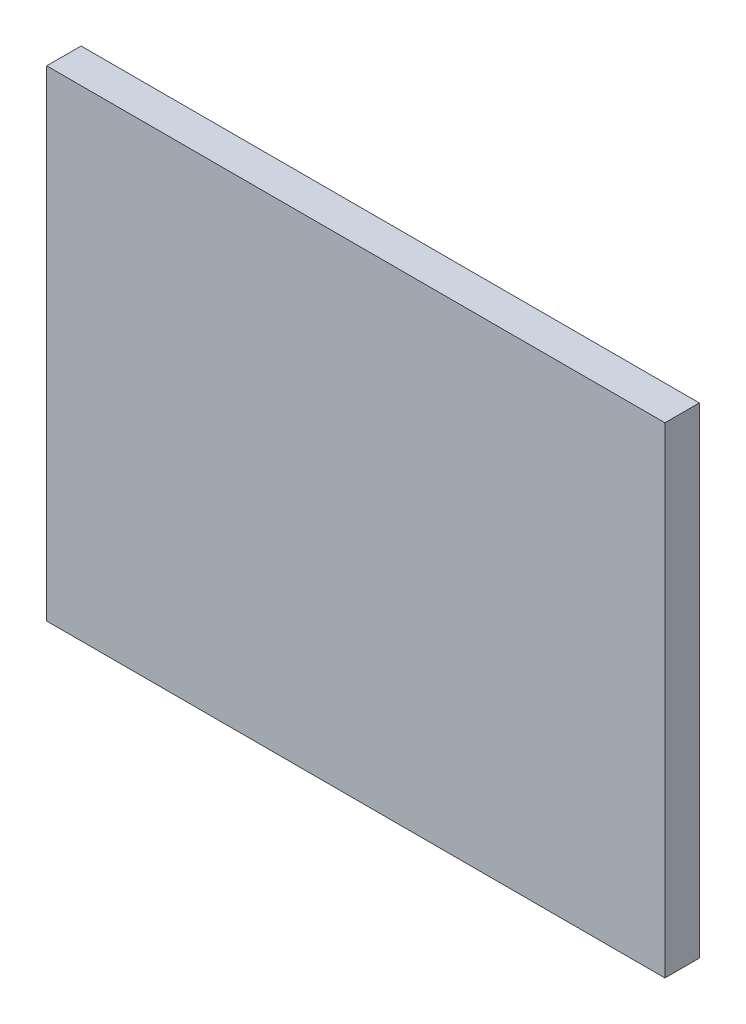
ISO-10303-21;
HEADER;
FILE_DESCRIPTION(('STEP AP214'),'2;1');
FILE_NAME('part.step','',(''),(''),'','','');
FILE_SCHEMA(('AUTOMOTIVE_DESIGN { 1 0 10303 214 1 1 1 1 }'));
ENDSEC;
DATA;
#1=APPLICATION_CONTEXT('core data for automotive mechanical design processes');
#2=APPLICATION_PROTOCOL_DEFINITION('international standard','automotive_design',2000,#1);
#3=PRODUCT_CONTEXT('',#1,'mechanical');
#4=PRODUCT('Part','Part','',(#3));
#5=PRODUCT_RELATED_PRODUCT_CATEGORY('part','',(#4));
#6=PRODUCT_DEFINITION_FORMATION('','',#4);
#7=PRODUCT_DEFINITION_CONTEXT('part definition',#1,'design');
#8=PRODUCT_DEFINITION('design','',#6,#7);
#9=PRODUCT_DEFINITION_SHAPE('','',#8);
#10=(LENGTH_UNIT() NAMED_UNIT(*) SI_UNIT(.MILLI.,.METRE.));
#11=(NAMED_UNIT(*) PLANE_ANGLE_UNIT() SI_UNIT($,.RADIAN.));
#12=(NAMED_UNIT(*) SI_UNIT($,.STERADIAN.) SOLID_ANGLE_UNIT());
#13=UNCERTAINTY_MEASURE_WITH_UNIT(LENGTH_MEASURE(1.E-05),#10,'distance_accuracy_value','');
#14=(GEOMETRIC_REPRESENTATION_CONTEXT(3) GLOBAL_UNCERTAINTY_ASSIGNED_CONTEXT((#13)) GLOBAL_UNIT_ASSIGNED_CONTEXT((#10,
#11,#12)) REPRESENTATION_CONTEXT('',''));
#15=CARTESIAN_POINT('',(0.,0.,0.));
#16=DIRECTION('',(0.,0.,1.));
#17=DIRECTION('',(1.,0.,0.));
#18=AXIS2_PLACEMENT_3D('',#15,#16,#17);
#19=CARTESIAN_POINT('',(-45.,-35.,5.));
#20=DIRECTION('',(1.,0.,0.));
#21=DIRECTION('',(0.,0.,-1.));
#22=AXIS2_PLACEMENT_3D('',#19,#20,#21);
#23=PLANE('',#22);
#24=DIRECTION('',(0.,-1.,0.));
#25=VECTOR('',#24,1.);
#26=CARTESIAN_POINT('',(-45.,-35.,0.));
#27=LINE('',#26,#25);
#28=CARTESIAN_POINT('',(-45.,35.,0.));
#29=VERTEX_POINT('',#28);
#30=CARTESIAN_POINT('',(-45.,-35.,0.));
#31=VERTEX_POINT('',#30);
#32=EDGE_CURVE('E107',#29,#31,#27,.T.);
#33=ORIENTED_EDGE('',*,*,#32,.T.);
#34=DIRECTION('',(0.,0.,-1.));
#35=VECTOR('',#34,1.);
#36=CARTESIAN_POINT('',(-45.,-35.,5.));
#37=LINE('',#36,#35);
#38=CARTESIAN_POINT('',(-45.,-35.,5.));
#39=VERTEX_POINT('',#38);
#40=EDGE_CURVE('E11',#39,#31,#37,.T.);
#41=ORIENTED_EDGE('',*,*,#40,.F.);
#42=DIRECTION('',(0.,-1.,0.));
#43=VECTOR('',#42,1.);
#44=CARTESIAN_POINT('',(-45.,-35.,5.));
#45=LINE('',#44,#43);
#46=CARTESIAN_POINT('',(-45.,35.,5.));
#47=VERTEX_POINT('',#46);
#48=EDGE_CURVE('E91',#47,#39,#45,.T.);
#49=ORIENTED_EDGE('',*,*,#48,.F.);
#50=DIRECTION('',(0.,0.,-1.));
#51=VECTOR('',#50,1.);
#52=CARTESIAN_POINT('',(-45.,35.,5.));
#53=LINE('',#52,#51);
#54=EDGE_CURVE('E103',#47,#29,#53,.T.);
#55=ORIENTED_EDGE('',*,*,#54,.T.);
#56=EDGE_LOOP('',(#33,#41,#49,#55));
#57=FACE_BOUND('',#56,.T.);
#58=ADVANCED_FACE('F39',(#57),#23,.F.);
#59=CARTESIAN_POINT('',(45.,-35.,5.));
#60=DIRECTION('',(0.,1.,0.));
#61=DIRECTION('',(-1.,0.,0.));
#62=AXIS2_PLACEMENT_3D('',#59,#60,#61);
#63=PLANE('',#62);
#64=DIRECTION('',(1.,0.,0.));
#65=VECTOR('',#64,1.);
#66=CARTESIAN_POINT('',(45.,-35.,0.));
#67=LINE('',#66,#65);
#68=CARTESIAN_POINT('',(45.,-35.,0.));
#69=VERTEX_POINT('',#68);
#70=EDGE_CURVE('E96',#31,#69,#67,.T.);
#71=ORIENTED_EDGE('',*,*,#70,.T.);
#72=DIRECTION('',(0.,0.,-1.));
#73=VECTOR('',#72,1.);
#74=CARTESIAN_POINT('',(45.,-35.,5.));
#75=LINE('',#74,#73);
#76=CARTESIAN_POINT('',(45.,-35.,5.));
#77=VERTEX_POINT('',#76);
#78=EDGE_CURVE('E48',#77,#69,#75,.T.);
#79=ORIENTED_EDGE('',*,*,#78,.F.);
#80=DIRECTION('',(1.,0.,0.));
#81=VECTOR('',#80,1.);
#82=CARTESIAN_POINT('',(45.,-35.,5.));
#83=LINE('',#82,#81);
#84=EDGE_CURVE('E86',#39,#77,#83,.T.);
#85=ORIENTED_EDGE('',*,*,#84,.F.);
#86=ORIENTED_EDGE('',*,*,#40,.T.);
#87=EDGE_LOOP('',(#71,#79,#85,#86));
#88=FACE_BOUND('',#87,.T.);
#89=ADVANCED_FACE('F95',(#88),#63,.F.);
#90=CARTESIAN_POINT('',(45.,-35.,5.));
#91=DIRECTION('',(-1.,0.,0.));
#92=DIRECTION('',(0.,0.,1.));
#93=AXIS2_PLACEMENT_3D('',#90,#91,#92);
#94=PLANE('',#93);
#95=DIRECTION('',(0.,1.,0.));
#96=VECTOR('',#95,1.);
#97=CARTESIAN_POINT('',(45.,-35.,0.));
#98=LINE('',#97,#96);
#99=CARTESIAN_POINT('',(45.,35.,0.));
#100=VERTEX_POINT('',#99);
#101=EDGE_CURVE('E73',#69,#100,#98,.T.);
#102=ORIENTED_EDGE('',*,*,#101,.T.);
#103=DIRECTION('',(0.,0.,-1.));
#104=VECTOR('',#103,1.);
#105=CARTESIAN_POINT('',(45.,35.,5.));
#106=LINE('',#105,#104);
#107=CARTESIAN_POINT('',(45.,35.,5.));
#108=VERTEX_POINT('',#107);
#109=EDGE_CURVE('E98',#108,#100,#106,.T.);
#110=ORIENTED_EDGE('',*,*,#109,.F.);
#111=DIRECTION('',(0.,1.,0.));
#112=VECTOR('',#111,1.);
#113=CARTESIAN_POINT('',(45.,-35.,5.));
#114=LINE('',#113,#112);
#115=EDGE_CURVE('E89',#77,#108,#114,.T.);
#116=ORIENTED_EDGE('',*,*,#115,.F.);
#117=ORIENTED_EDGE('',*,*,#78,.T.);
#118=EDGE_LOOP('',(#102,#110,#116,#117));
#119=FACE_BOUND('',#118,.T.);
#120=ADVANCED_FACE('F99',(#119),#94,.F.);
#121=CARTESIAN_POINT('',(45.,35.,5.));
#122=DIRECTION('',(0.,-1.,0.));
#123=DIRECTION('',(1.,0.,0.));
#124=AXIS2_PLACEMENT_3D('',#121,#122,#123);
#125=PLANE('',#124);
#126=DIRECTION('',(-1.,0.,0.));
#127=VECTOR('',#126,1.);
#128=CARTESIAN_POINT('',(45.,35.,0.));
#129=LINE('',#128,#127);
#130=EDGE_CURVE('E79',#100,#29,#129,.T.);
#131=ORIENTED_EDGE('',*,*,#130,.T.);
#132=ORIENTED_EDGE('',*,*,#54,.F.);
#133=DIRECTION('',(-1.,0.,0.));
#134=VECTOR('',#133,1.);
#135=CARTESIAN_POINT('',(45.,35.,5.));
#136=LINE('',#135,#134);
#137=EDGE_CURVE('E56',#108,#47,#136,.T.);
#138=ORIENTED_EDGE('',*,*,#137,.F.);
#139=ORIENTED_EDGE('',*,*,#109,.T.);
#140=EDGE_LOOP('',(#131,#132,#138,#139));
#141=FACE_BOUND('',#140,.T.);
#142=ADVANCED_FACE('F120',(#141),#125,.F.);
#143=CARTESIAN_POINT('',(0.,0.,5.));
#144=DIRECTION('',(0.,0.,1.));
#145=DIRECTION('',(1.,0.,0.));
#146=AXIS2_PLACEMENT_3D('',#143,#144,#145);
#147=PLANE('',#146);
#148=ORIENTED_EDGE('',*,*,#48,.T.);
#149=ORIENTED_EDGE('',*,*,#84,.T.);
#150=ORIENTED_EDGE('',*,*,#115,.T.);
#151=ORIENTED_EDGE('',*,*,#137,.T.);
#152=EDGE_LOOP('',(#148,#149,#150,#151));
#153=FACE_BOUND('',#152,.T.);
#154=ADVANCED_FACE('F87',(#153),#147,.T.);
#155=CARTESIAN_POINT('',(0.,0.,0.));
#156=DIRECTION('',(0.,0.,1.));
#157=DIRECTION('',(1.,0.,0.));
#158=AXIS2_PLACEMENT_3D('',#155,#156,#157);
#159=PLANE('',#158);
#160=ORIENTED_EDGE('',*,*,#32,.F.);
#161=ORIENTED_EDGE('',*,*,#130,.F.);
#162=ORIENTED_EDGE('',*,*,#101,.F.);
#163=ORIENTED_EDGE('',*,*,#70,.F.);
#164=EDGE_LOOP('',(#160,#161,#162,#163));
#165=FACE_BOUND('',#164,.T.);
#166=ADVANCED_FACE('F123',(#165),#159,.F.);
#167=CLOSED_SHELL('',(#58,#89,#120,#142,#154,#166));
#168=MANIFOLD_SOLID_BREP('B2',#167);
#169=ADVANCED_BREP_SHAPE_REPRESENTATION('',(#18,#168),#14);
#170=SHAPE_DEFINITION_REPRESENTATION(#9,#169);
ENDSEC;
END-ISO-10303-21;
